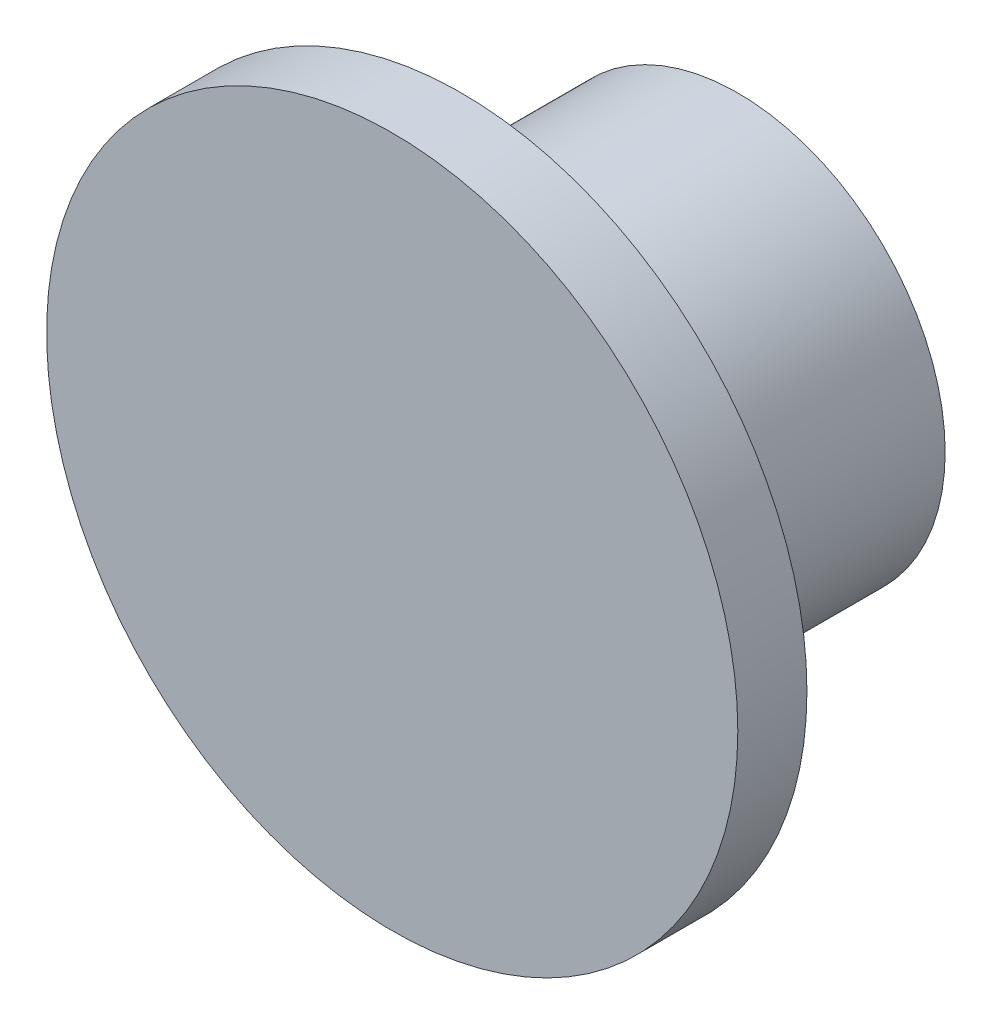
ISO-10303-21;
HEADER;
FILE_DESCRIPTION(('STEP AP214'),'2;1');
FILE_NAME('part.step','',(''),(''),'','','');
FILE_SCHEMA(('AUTOMOTIVE_DESIGN { 1 0 10303 214 1 1 1 1 }'));
ENDSEC;
DATA;
#1=APPLICATION_CONTEXT('core data for automotive mechanical design processes');
#2=APPLICATION_PROTOCOL_DEFINITION('international standard','automotive_design',2000,#1);
#3=PRODUCT_CONTEXT('',#1,'mechanical');
#4=PRODUCT('Part','Part','',(#3));
#5=PRODUCT_RELATED_PRODUCT_CATEGORY('part','',(#4));
#6=PRODUCT_DEFINITION_FORMATION('','',#4);
#7=PRODUCT_DEFINITION_CONTEXT('part definition',#1,'design');
#8=PRODUCT_DEFINITION('design','',#6,#7);
#9=PRODUCT_DEFINITION_SHAPE('','',#8);
#10=(LENGTH_UNIT() NAMED_UNIT(*) SI_UNIT(.MILLI.,.METRE.));
#11=(NAMED_UNIT(*) PLANE_ANGLE_UNIT() SI_UNIT($,.RADIAN.));
#12=(NAMED_UNIT(*) SI_UNIT($,.STERADIAN.) SOLID_ANGLE_UNIT());
#13=UNCERTAINTY_MEASURE_WITH_UNIT(LENGTH_MEASURE(1.E-05),#10,'distance_accuracy_value','');
#14=(GEOMETRIC_REPRESENTATION_CONTEXT(3) GLOBAL_UNCERTAINTY_ASSIGNED_CONTEXT((#13)) GLOBAL_UNIT_ASSIGNED_CONTEXT((#10,
#11,#12)) REPRESENTATION_CONTEXT('',''));
#15=CARTESIAN_POINT('',(0.,0.,0.));
#16=DIRECTION('',(0.,0.,1.));
#17=DIRECTION('',(1.,0.,0.));
#18=AXIS2_PLACEMENT_3D('',#15,#16,#17);
#19=CARTESIAN_POINT('',(0.,0.,5.));
#20=DIRECTION('',(0.,0.,-1.));
#21=DIRECTION('',(-1.,0.,0.));
#22=AXIS2_PLACEMENT_3D('',#19,#20,#21);
#23=CYLINDRICAL_SURFACE('',#22,25.);
#24=CARTESIAN_POINT('',(0.,0.,5.));
#25=DIRECTION('',(0.,0.,1.));
#26=DIRECTION('',(1.,0.,0.));
#27=AXIS2_PLACEMENT_3D('',#24,#25,#26);
#28=CIRCLE('',#27,25.);
#29=CARTESIAN_POINT('',(25.,0.,5.));
#30=VERTEX_POINT('',#29);
#31=EDGE_CURVE('E11',#30,#30,#28,.T.);
#32=ORIENTED_EDGE('',*,*,#31,.F.);
#33=EDGE_LOOP('',(#32));
#34=FACE_BOUND('',#33,.T.);
#35=CARTESIAN_POINT('',(0.,0.,0.));
#36=DIRECTION('',(0.,0.,1.));
#37=DIRECTION('',(1.,0.,0.));
#38=AXIS2_PLACEMENT_3D('',#35,#36,#37);
#39=CIRCLE('',#38,25.);
#40=CARTESIAN_POINT('',(25.,0.,0.));
#41=VERTEX_POINT('',#40);
#42=EDGE_CURVE('E44',#41,#41,#39,.T.);
#43=ORIENTED_EDGE('',*,*,#42,.T.);
#44=EDGE_LOOP('',(#43));
#45=FACE_BOUND('',#44,.T.);
#46=ADVANCED_FACE('F41',(#34,#45),#23,.T.);
#47=CARTESIAN_POINT('',(0.,0.,0.));
#48=DIRECTION('',(0.,0.,1.));
#49=DIRECTION('',(1.,0.,0.));
#50=AXIS2_PLACEMENT_3D('',#47,#48,#49);
#51=PLANE('',#50);
#52=CARTESIAN_POINT('',(0.,0.,0.));
#53=DIRECTION('',(0.,0.,1.));
#54=DIRECTION('',(1.,0.,0.));
#55=AXIS2_PLACEMENT_3D('',#52,#53,#54);
#56=CIRCLE('',#55,15.);
#57=CARTESIAN_POINT('',(15.,0.,0.));
#58=VERTEX_POINT('',#57);
#59=EDGE_CURVE('E53',#58,#58,#56,.T.);
#60=ORIENTED_EDGE('',*,*,#59,.T.);
#61=EDGE_LOOP('',(#60));
#62=FACE_BOUND('',#61,.T.);
#63=ORIENTED_EDGE('',*,*,#42,.F.);
#64=EDGE_LOOP('',(#63));
#65=FACE_BOUND('',#64,.T.);
#66=ADVANCED_FACE('F71',(#62,#65),#51,.F.);
#67=CARTESIAN_POINT('',(0.,0.,5.));
#68=DIRECTION('',(0.,0.,1.));
#69=DIRECTION('',(1.,0.,0.));
#70=AXIS2_PLACEMENT_3D('',#67,#68,#69);
#71=PLANE('',#70);
#72=ORIENTED_EDGE('',*,*,#31,.T.);
#73=EDGE_LOOP('',(#72));
#74=FACE_BOUND('',#73,.T.);
#75=ADVANCED_FACE('F68',(#74),#71,.T.);
#76=CARTESIAN_POINT('',(0.,0.,-20.));
#77=DIRECTION('',(0.,0.,1.));
#78=DIRECTION('',(1.,0.,0.));
#79=AXIS2_PLACEMENT_3D('',#76,#77,#78);
#80=CYLINDRICAL_SURFACE('',#79,15.);
#81=CARTESIAN_POINT('',(0.,0.,-20.));
#82=DIRECTION('',(0.,0.,1.));
#83=DIRECTION('',(1.,0.,0.));
#84=AXIS2_PLACEMENT_3D('',#81,#82,#83);
#85=CIRCLE('',#84,15.);
#86=CARTESIAN_POINT('',(15.,0.,-20.));
#87=VERTEX_POINT('',#86);
#88=EDGE_CURVE('E51',#87,#87,#85,.T.);
#89=ORIENTED_EDGE('',*,*,#88,.T.);
#90=EDGE_LOOP('',(#89));
#91=FACE_BOUND('',#90,.T.);
#92=ORIENTED_EDGE('',*,*,#59,.F.);
#93=EDGE_LOOP('',(#92));
#94=FACE_BOUND('',#93,.T.);
#95=ADVANCED_FACE('F59',(#91,#94),#80,.T.);
#96=CARTESIAN_POINT('',(0.,0.,-20.));
#97=DIRECTION('',(0.,0.,1.));
#98=DIRECTION('',(1.,0.,0.));
#99=AXIS2_PLACEMENT_3D('',#96,#97,#98);
#100=PLANE('',#99);
#101=ORIENTED_EDGE('',*,*,#88,.F.);
#102=EDGE_LOOP('',(#101));
#103=FACE_BOUND('',#102,.T.);
#104=ADVANCED_FACE('F62',(#103),#100,.F.);
#105=CLOSED_SHELL('',(#46,#66,#75,#95,#104));
#106=MANIFOLD_SOLID_BREP('B2',#105);
#107=ADVANCED_BREP_SHAPE_REPRESENTATION('',(#18,#106),#14);
#108=SHAPE_DEFINITION_REPRESENTATION(#9,#107);
ENDSEC;
END-ISO-10303-21;
